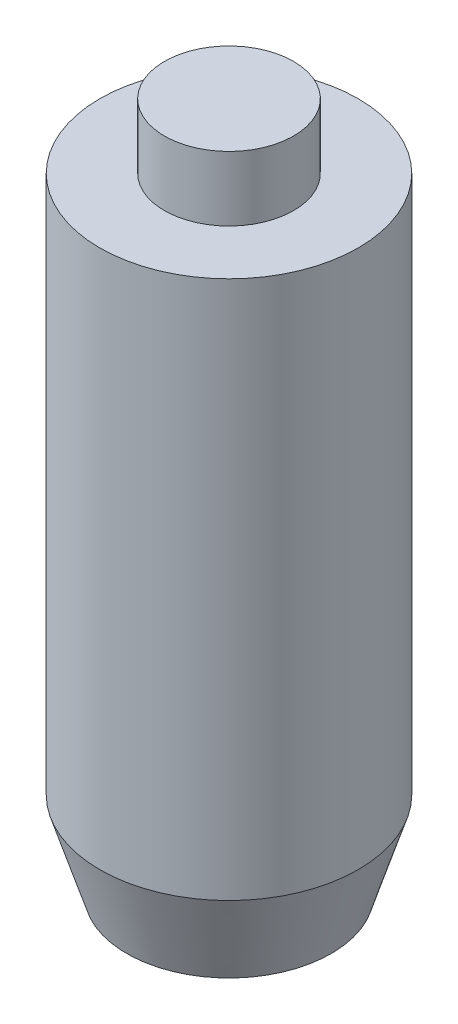
ISO-10303-21;
HEADER;
FILE_DESCRIPTION(('STEP AP214'),'2;1');
FILE_NAME('part.step','',(''),(''),'','','');
FILE_SCHEMA(('AUTOMOTIVE_DESIGN { 1 0 10303 214 1 1 1 1 }'));
ENDSEC;
DATA;
#1=APPLICATION_CONTEXT('core data for automotive mechanical design processes');
#2=APPLICATION_PROTOCOL_DEFINITION('international standard','automotive_design',2000,#1);
#3=PRODUCT_CONTEXT('',#1,'mechanical');
#4=PRODUCT('Part','Part','',(#3));
#5=PRODUCT_RELATED_PRODUCT_CATEGORY('part','',(#4));
#6=PRODUCT_DEFINITION_FORMATION('','',#4);
#7=PRODUCT_DEFINITION_CONTEXT('part definition',#1,'design');
#8=PRODUCT_DEFINITION('design','',#6,#7);
#9=PRODUCT_DEFINITION_SHAPE('','',#8);
#10=(LENGTH_UNIT() NAMED_UNIT(*) SI_UNIT(.MILLI.,.METRE.));
#11=(NAMED_UNIT(*) PLANE_ANGLE_UNIT() SI_UNIT($,.RADIAN.));
#12=(NAMED_UNIT(*) SI_UNIT($,.STERADIAN.) SOLID_ANGLE_UNIT());
#13=UNCERTAINTY_MEASURE_WITH_UNIT(LENGTH_MEASURE(1.E-05),#10,'distance_accuracy_value','');
#14=(GEOMETRIC_REPRESENTATION_CONTEXT(3) GLOBAL_UNCERTAINTY_ASSIGNED_CONTEXT((#13)) GLOBAL_UNIT_ASSIGNED_CONTEXT((#10,
#11,#12)) REPRESENTATION_CONTEXT('',''));
#15=CARTESIAN_POINT('',(0.,0.,0.));
#16=DIRECTION('',(0.,0.,1.));
#17=DIRECTION('',(1.,0.,0.));
#18=AXIS2_PLACEMENT_3D('',#15,#16,#17);
#19=CARTESIAN_POINT('',(29.75,112.5,0.));
#20=DIRECTION('',(0.,1.,0.));
#21=DIRECTION('',(0.,0.,1.));
#22=AXIS2_PLACEMENT_3D('',#19,#20,#21);
#23=PLANE('',#22);
#24=CARTESIAN_POINT('',(29.75,112.5,0.));
#25=DIRECTION('',(0.,-1.,0.));
#26=DIRECTION('',(0.,0.,-1.));
#27=AXIS2_PLACEMENT_3D('',#24,#25,#26);
#28=CIRCLE('',#27,3.);
#29=CARTESIAN_POINT('',(29.75,112.5,-3.));
#30=VERTEX_POINT('',#29);
#31=EDGE_CURVE('E41',#30,#30,#28,.T.);
#32=ORIENTED_EDGE('',*,*,#31,.F.);
#33=EDGE_LOOP('',(#32));
#34=FACE_BOUND('',#33,.T.);
#35=ADVANCED_FACE('F31',(#34),#23,.T.);
#36=CARTESIAN_POINT('',(29.75,33.4895404193071,0.));
#37=DIRECTION('',(0.,-1.,0.));
#38=DIRECTION('',(0.,0.,-1.));
#39=AXIS2_PLACEMENT_3D('',#36,#37,#38);
#40=CYLINDRICAL_SURFACE('',#39,3.);
#41=ORIENTED_EDGE('',*,*,#31,.T.);
#42=EDGE_LOOP('',(#41));
#43=FACE_BOUND('',#42,.T.);
#44=CARTESIAN_POINT('',(29.75,109.5,0.));
#45=DIRECTION('',(0.,-1.,0.));
#46=DIRECTION('',(0.,0.,-1.));
#47=AXIS2_PLACEMENT_3D('',#44,#45,#46);
#48=CIRCLE('',#47,3.);
#49=CARTESIAN_POINT('',(29.75,109.5,-3.));
#50=VERTEX_POINT('',#49);
#51=EDGE_CURVE('E45',#50,#50,#48,.T.);
#52=ORIENTED_EDGE('',*,*,#51,.F.);
#53=EDGE_LOOP('',(#52));
#54=FACE_BOUND('',#53,.T.);
#55=ADVANCED_FACE('F81',(#43,#54),#40,.T.);
#56=CARTESIAN_POINT('',(32.75,109.5,0.));
#57=DIRECTION('',(0.,1.,0.));
#58=DIRECTION('',(0.,0.,1.));
#59=AXIS2_PLACEMENT_3D('',#56,#57,#58);
#60=PLANE('',#59);
#61=ORIENTED_EDGE('',*,*,#51,.T.);
#62=EDGE_LOOP('',(#61));
#63=FACE_BOUND('',#62,.T.);
#64=CARTESIAN_POINT('',(29.75,109.5,0.));
#65=DIRECTION('',(0.,-1.,0.));
#66=DIRECTION('',(0.,0.,-1.));
#67=AXIS2_PLACEMENT_3D('',#64,#65,#66);
#68=CIRCLE('',#67,6.00000000000001);
#69=CARTESIAN_POINT('',(29.75,109.5,-6.00000000000001));
#70=VERTEX_POINT('',#69);
#71=EDGE_CURVE('E50',#70,#70,#68,.T.);
#72=ORIENTED_EDGE('',*,*,#71,.F.);
#73=EDGE_LOOP('',(#72));
#74=FACE_BOUND('',#73,.T.);
#75=ADVANCED_FACE('F86',(#63,#74),#60,.T.);
#76=CARTESIAN_POINT('',(29.75,33.4895404193071,0.));
#77=DIRECTION('',(0.,-1.,0.));
#78=DIRECTION('',(0.,0.,-1.));
#79=AXIS2_PLACEMENT_3D('',#76,#77,#78);
#80=CYLINDRICAL_SURFACE('',#79,6.00000000000001);
#81=CARTESIAN_POINT('',(29.75,102.85,-6.00000000000001));
#82=CARTESIAN_POINT('',(29.8368551540295,102.850000304322,-6.00000027636888));
#83=CARTESIAN_POINT('',(29.9237059578463,102.846618418426,-5.99810998912827));
#84=CARTESIAN_POINT('',(30.0967517749576,102.833136348748,-5.99059818772049));
#85=CARTESIAN_POINT('',(30.1829465485054,102.823033817904,-5.98497537003771));
#86=CARTESIAN_POINT('',(30.3539678085947,102.79624171794,-5.97014105022579));
#87=CARTESIAN_POINT('',(30.4387946890976,102.779554081955,-5.96093060129874));
#88=CARTESIAN_POINT('',(30.6065133126573,102.73980349301,-5.93915440656428));
#89=CARTESIAN_POINT('',(30.6894042450665,102.716737919512,-5.92658728165435));
#90=CARTESIAN_POINT('',(30.9336532074442,102.638557897051,-5.88439376853852));
#91=CARTESIAN_POINT('',(31.0914147092894,102.574327603266,-5.85019917962473));
#92=CARTESIAN_POINT('',(31.3935292768716,102.424014620956,-5.77262790541994));
#93=CARTESIAN_POINT('',(31.5378790688034,102.337926615996,-5.72924898665785));
#94=CARTESIAN_POINT('',(31.8205178397697,102.139564400775,-5.63353551950775));
#95=CARTESIAN_POINT('',(31.9576758857777,102.025879330651,-5.58078670377474));
#96=CARTESIAN_POINT('',(32.2120587356691,101.778657967711,-5.47333373388227));
#97=CARTESIAN_POINT('',(32.3292629196769,101.645101403937,-5.41862762688137));
#98=CARTESIAN_POINT('',(32.5525677875686,101.345666831759,-5.30685805578659));
#99=CARTESIAN_POINT('',(32.6562949058159,101.177878481893,-5.25012874775908));
#100=CARTESIAN_POINT('',(32.8336080224297,100.823964830311,-5.14799909803482));
#101=CARTESIAN_POINT('',(32.9072375745185,100.637866512332,-5.10258242347392));
#102=CARTESIAN_POINT('',(33.0086201803895,100.293086898827,-5.03827388818848));
#103=CARTESIAN_POINT('',(33.0427910003627,100.136961257846,-5.01579940121693));
#104=CARTESIAN_POINT('',(33.0885018346884,99.8200943558299,-4.985498277761));
#105=CARTESIAN_POINT('',(33.1000644796513,99.6593578739613,-4.97765699391097));
#106=CARTESIAN_POINT('',(33.099934887448,99.3377218199167,-4.97774397632757));
#107=CARTESIAN_POINT('',(33.0882161502392,99.1768222704877,-4.98569021274607));
#108=CARTESIAN_POINT('',(33.0421464413088,98.8596986440607,-5.01622419723049));
#109=CARTESIAN_POINT('',(33.0077806088655,98.7034777075228,-5.0388215590121));
#110=CARTESIAN_POINT('',(32.9180807329477,98.3996021576457,-5.09568908770972));
#111=CARTESIAN_POINT('',(32.8627560778565,98.2519437428727,-5.12995402750751));
#112=CARTESIAN_POINT('',(32.7330323895877,97.9675233971528,-5.20645555081259));
#113=CARTESIAN_POINT('',(32.6586259288189,97.8307657365567,-5.24869523679619));
#114=CARTESIAN_POINT('',(32.479629990647,97.5497549247423,-5.34423968929555));
#115=CARTESIAN_POINT('',(32.3721611936242,97.4075707657632,-5.39824783610552));
#116=CARTESIAN_POINT('',(32.136171877236,97.1419685903024,-5.50664097372976));
#117=CARTESIAN_POINT('',(32.0076345089257,97.0185657471861,-5.56102623251527));
#118=CARTESIAN_POINT('',(31.7169952521756,96.7811627794859,-5.67074625744229));
#119=CARTESIAN_POINT('',(31.5527964393194,96.6694573616843,-5.72559682611537));
#120=CARTESIAN_POINT('',(31.2918780975823,96.5242548218518,-5.79921064420883));
#121=CARTESIAN_POINT('',(31.2024317198732,96.479567131229,-5.82231206815501));
#122=CARTESIAN_POINT('',(31.0192092036394,96.3981236062433,-5.86497464495178));
#123=CARTESIAN_POINT('',(30.9254356986299,96.3613630227144,-5.88453791638603));
#124=CARTESIAN_POINT('',(30.7409744146134,96.2985489041987,-5.91828855790644));
#125=CARTESIAN_POINT('',(30.6505317267497,96.2719251180123,-5.93275680054454));
#126=CARTESIAN_POINT('',(30.4672429817222,96.2263208881226,-5.95769335902741));
#127=CARTESIAN_POINT('',(30.3743982245178,96.2073363985856,-5.96816379199401));
#128=CARTESIAN_POINT('',(30.1870936737385,96.1772849302904,-5.98479546407428));
#129=CARTESIAN_POINT('',(30.0926347215339,96.1662139483292,-5.99095888194058));
#130=CARTESIAN_POINT('',(29.9029649192467,96.1521409703368,-5.99880262492516));
#131=CARTESIAN_POINT('',(29.8077541457922,96.149138162352,-6.00048340116119));
#132=CARTESIAN_POINT('',(29.5441890569086,96.1521036201346,-5.99882157990127));
#133=CARTESIAN_POINT('',(29.3758588198304,96.1667403606259,-5.99062543549092));
#134=CARTESIAN_POINT('',(29.0445971642846,96.2208028552261,-5.96071694620634));
#135=CARTESIAN_POINT('',(28.8816659080745,96.2602293536403,-5.93900419550006));
#136=CARTESIAN_POINT('',(28.566025480184,96.361837597776,-5.88419460559967));
#137=CARTESIAN_POINT('',(28.4132713714545,96.4239102110766,-5.85115240860889));
#138=CARTESIAN_POINT('',(28.1201944285302,96.5686215319669,-5.77638709310673));
#139=CARTESIAN_POINT('',(27.9798748751021,96.6512656454187,-5.73466169326145));
#140=CARTESIAN_POINT('',(27.7000513265921,96.8444345902526,-5.64106881263141));
#141=CARTESIAN_POINT('',(27.5621298111738,96.9569579390029,-5.58859885623955));
#142=CARTESIAN_POINT('',(27.3060627620048,97.2019306131935,-5.48146709171847));
#143=CARTESIAN_POINT('',(27.1879394580852,97.3344020241844,-5.42680290406517));
#144=CARTESIAN_POINT('',(26.9625405359646,97.6316212684909,-5.31483492164684));
#145=CARTESIAN_POINT('',(26.8576219506571,97.7982862557179,-5.25783588780468));
#146=CARTESIAN_POINT('',(26.6776869545542,98.1500813156604,-5.154774733582));
#147=CARTESIAN_POINT('',(26.6026285996905,98.3351850272762,-5.10869730889801));
#148=CARTESIAN_POINT('',(26.498304045392,98.6789403576196,-5.04276262548888));
#149=CARTESIAN_POINT('',(26.4627399602819,98.8350138599545,-5.01943518993202));
#150=CARTESIAN_POINT('',(26.4142727102012,99.1520503330197,-4.98736443622106));
#151=CARTESIAN_POINT('',(26.4013463642675,99.3130081301724,-4.97860619972118));
#152=CARTESIAN_POINT('',(26.3988522186784,99.6354066793786,-4.97692798865142));
#153=CARTESIAN_POINT('',(26.4093164165009,99.7968477909284,-4.98402970995866));
#154=CARTESIAN_POINT('',(26.4530598234623,100.115265612845,-5.01306740779636));
#155=CARTESIAN_POINT('',(26.4863536153714,100.27223940285,-5.03501286588049));
#156=CARTESIAN_POINT('',(26.5738965673795,100.576982792717,-5.09067835832131));
#157=CARTESIAN_POINT('',(26.6280324101682,100.724797231368,-5.12433462791327));
#158=CARTESIAN_POINT('',(26.7553845682887,101.009688490857,-5.19978335620498));
#159=CARTESIAN_POINT('',(26.8286081858021,101.146761176193,-5.24157892710873));
#160=CARTESIAN_POINT('',(27.004894575762,101.428340657665,-5.33627524257005));
#161=CARTESIAN_POINT('',(27.11079678963,101.57083001576,-5.3898992290315));
#162=CARTESIAN_POINT('',(27.343581925839,101.83731085614,-5.49778674900258));
#163=CARTESIAN_POINT('',(27.4704818759373,101.961287169071,-5.55205076809344));
#164=CARTESIAN_POINT('',(27.758187223614,102.200696567972,-5.66204551591838));
#165=CARTESIAN_POINT('',(27.9211713378169,102.31377659422,-5.7173062588729));
#166=CARTESIAN_POINT('',(28.1804155087186,102.461220548991,-5.79176593089869));
#167=CARTESIAN_POINT('',(28.2693281704916,102.50668557946,-5.81518787866733));
#168=CARTESIAN_POINT('',(28.4515466179106,102.589744776144,-5.85856315041256));
#169=CARTESIAN_POINT('',(28.5448497337032,102.627343651933,-5.87851854863808));
#170=CARTESIAN_POINT('',(28.7281260653899,102.691708329043,-5.91302135380705));
#171=CARTESIAN_POINT('',(28.8178361911204,102.719069168371,-5.9278593417526));
#172=CARTESIAN_POINT('',(28.9997269760477,102.766253206775,-5.95361389647255));
#173=CARTESIAN_POINT('',(29.0919063105161,102.78608036427,-5.96453252242921));
#174=CARTESIAN_POINT('',(29.2779620183266,102.817918606935,-5.98213238555485));
#175=CARTESIAN_POINT('',(29.3718375767609,102.829933347886,-5.98881560462489));
#176=CARTESIAN_POINT('',(29.5604771921481,102.84597359265,-5.99774910252943));
#177=CARTESIAN_POINT('',(29.6552411850531,102.849999667985,-5.99999969848207));
#178=CARTESIAN_POINT('',(29.75,102.85,-6.00000000000001));
#179=B_SPLINE_CURVE_WITH_KNOTS('',3,(#81,#82,#83,#84,#85,#86,#87,#88,#89,#90,#91,#92,#93,#94,
#95,#96,#97,#98,#99,#100,#101,#102,#103,#104,#105,#106,#107,#108,#109,#110,#111,#112,#113,#114,
#115,#116,#117,#118,#119,#120,#121,#122,#123,#124,#125,#126,#127,#128,#129,#130,#131,#132,#133,
#134,#135,#136,#137,#138,#139,#140,#141,#142,#143,#144,#145,#146,#147,#148,#149,#150,#151,#152,
#153,#154,#155,#156,#157,#158,#159,#160,#161,#162,#163,#164,#165,#166,#167,#168,#169,#170,#171,
#172,#173,#174,#175,#176,#177,#178),.UNSPECIFIED.,.T.,.F.,(4,2,2,2,2,2,2,2,2,2,2,2,2,2,2,2,2,2,
2,2,2,2,2,2,2,2,2,2,2,2,2,2,2,2,2,2,2,2,2,2,2,2,2,2,2,2,2,2,4),(0.,0.260471705958155,
0.52103442461859,0.781520708827848,1.04211417983508,1.56080938242307,2.07963086794375,
2.63475725826134,3.19045386694897,3.80317389758447,4.41500410464307,4.89707807136326,
5.37866923818835,5.8608088904248,6.34326523171541,6.82550571453175,7.30793419507963,
7.86437671475594,8.42126642312554,9.03578789468688,9.34328329595148,9.65059396032605,
9.93634393493258,10.2219423742209,10.5073962354983,10.7928213685897,11.2976118803894,
11.8024175491032,12.3048219985583,12.8073586115272,13.3618223946317,13.916904629692,
14.5289478675757,15.1401283190041,15.6233193211286,16.1060152474688,16.589371889656,
17.0730375716365,17.5541098973533,18.035366531934,18.5894993720118,19.1440837990039,
19.75831695226,20.0656672543029,20.3728330115786,20.6573103271066,20.9416379624048,
21.2258324520213,21.5100066090946),.UNSPECIFIED.);
#180=CARTESIAN_POINT('',(29.75,102.85,-6.00000000000001));
#181=VERTEX_POINT('',#180);
#182=EDGE_CURVE('E10',#181,#181,#179,.T.);
#183=ORIENTED_EDGE('',*,*,#182,.F.);
#184=EDGE_LOOP('',(#183));
#185=FACE_BOUND('',#184,.T.);
#186=ORIENTED_EDGE('',*,*,#71,.T.);
#187=EDGE_LOOP('',(#186));
#188=FACE_BOUND('',#187,.T.);
#189=CARTESIAN_POINT('',(29.75,84.5,0.));
#190=DIRECTION('',(0.,-1.,0.));
#191=DIRECTION('',(0.,0.,-1.));
#192=AXIS2_PLACEMENT_3D('',#189,#190,#191);
#193=CIRCLE('',#192,6.00000000000001);
#194=CARTESIAN_POINT('',(29.75,84.5,-6.00000000000001));
#195=VERTEX_POINT('',#194);
#196=EDGE_CURVE('E114',#195,#195,#193,.T.);
#197=ORIENTED_EDGE('',*,*,#196,.F.);
#198=EDGE_LOOP('',(#197));
#199=FACE_BOUND('',#198,.T.);
#200=ADVANCED_FACE('F90',(#185,#188,#199),#80,.T.);
#201=CARTESIAN_POINT('',(29.75,80.5,0.));
#202=DIRECTION('',(0.,1.,0.));
#203=DIRECTION('',(0.,0.,1.));
#204=AXIS2_PLACEMENT_3D('',#201,#202,#203);
#205=CONICAL_SURFACE('',#204,4.75,0.302884868374973);
#206=ORIENTED_EDGE('',*,*,#196,.T.);
#207=EDGE_LOOP('',(#206));
#208=FACE_BOUND('',#207,.T.);
#209=CARTESIAN_POINT('',(29.75,80.5,0.));
#210=DIRECTION('',(0.,-1.,0.));
#211=DIRECTION('',(0.,0.,-1.));
#212=AXIS2_PLACEMENT_3D('',#209,#210,#211);
#213=CIRCLE('',#212,4.75);
#214=CARTESIAN_POINT('',(29.75,80.5,-4.75));
#215=VERTEX_POINT('',#214);
#216=EDGE_CURVE('E108',#215,#215,#213,.T.);
#217=ORIENTED_EDGE('',*,*,#216,.F.);
#218=EDGE_LOOP('',(#217));
#219=FACE_BOUND('',#218,.T.);
#220=ADVANCED_FACE('F97',(#208,#219),#205,.T.);
#221=CARTESIAN_POINT('',(34.5,80.5,0.));
#222=DIRECTION('',(0.,-1.,0.));
#223=DIRECTION('',(0.,0.,-1.));
#224=AXIS2_PLACEMENT_3D('',#221,#222,#223);
#225=PLANE('',#224);
#226=ORIENTED_EDGE('',*,*,#216,.T.);
#227=EDGE_LOOP('',(#226));
#228=FACE_BOUND('',#227,.T.);
#229=CARTESIAN_POINT('',(29.75,80.5,0.));
#230=DIRECTION('',(0.,-1.,0.));
#231=DIRECTION('',(0.,0.,-1.));
#232=AXIS2_PLACEMENT_3D('',#229,#230,#231);
#233=CIRCLE('',#232,2.25);
#234=CARTESIAN_POINT('',(29.75,80.5,-2.25));
#235=VERTEX_POINT('',#234);
#236=EDGE_CURVE('E111',#235,#235,#233,.T.);
#237=ORIENTED_EDGE('',*,*,#236,.F.);
#238=EDGE_LOOP('',(#237));
#239=FACE_BOUND('',#238,.T.);
#240=ADVANCED_FACE('F77',(#228,#239),#225,.T.);
#241=CARTESIAN_POINT('',(29.75,33.4895404193071,0.));
#242=DIRECTION('',(0.,-1.,0.));
#243=DIRECTION('',(0.,0.,-1.));
#244=AXIS2_PLACEMENT_3D('',#241,#242,#243);
#245=CYLINDRICAL_SURFACE('',#244,2.25);
#246=CARTESIAN_POINT('',(29.75,101.2,-2.25));
#247=CARTESIAN_POINT('',(29.6671505458232,101.199993737984,-2.24999397873747));
#248=CARTESIAN_POINT('',(29.5841819620442,101.193894971028,-2.24537639018974));
#249=CARTESIAN_POINT('',(29.4208715135823,101.169886839272,-2.22732168603813));
#250=CARTESIAN_POINT('',(29.3405359659719,101.151950982857,-2.21386478822356));
#251=CARTESIAN_POINT('',(29.1852820029082,101.105497340953,-2.17942208711645));
#252=CARTESIAN_POINT('',(29.1103341792896,101.077043202063,-2.15848159222476));
#253=CARTESIAN_POINT('',(28.9667823851186,101.01090153919,-2.11064041652594));
#254=CARTESIAN_POINT('',(28.8981770409221,100.973216021008,-2.0837410305923));
#255=CARTESIAN_POINT('',(28.7619824228829,100.885986505721,-2.02296451421029));
#256=CARTESIAN_POINT('',(28.6950801859493,100.83566590281,-1.98867122471777));
#257=CARTESIAN_POINT('',(28.5701084384363,100.726680316013,-1.91717287667736));
#258=CARTESIAN_POINT('',(28.5120525764834,100.668002703009,-1.87996345025049));
#259=CARTESIAN_POINT('',(28.3940839086691,100.530216100721,-1.79727033349693));
#260=CARTESIAN_POINT('',(28.3362563957584,100.449388999595,-1.75166249671311));
#261=CARTESIAN_POINT('',(28.2347711050041,100.277203060994,-1.66463962039784));
#262=CARTESIAN_POINT('',(28.1910947280195,100.185858263063,-1.62321912704701));
#263=CARTESIAN_POINT('',(28.1321788266099,100.026450983914,-1.56405221273397));
#264=CARTESIAN_POINT('',(28.1123306618746,99.9613065323178,-1.54307806859753));
#265=CARTESIAN_POINT('',(28.0803947272107,99.8273218484432,-1.50846819980739));
#266=CARTESIAN_POINT('',(28.0682890097563,99.7584905672068,-1.49481551547025));
#267=CARTESIAN_POINT('',(28.0526099593748,99.6179086940979,-1.47699815695633));
#268=CARTESIAN_POINT('',(28.0491180920724,99.5461367071323,-1.47292408950747));
#269=CARTESIAN_POINT('',(28.0512638660068,99.4029008555726,-1.47539698661642));
#270=CARTESIAN_POINT('',(28.0569041427352,99.3314370858966,-1.48194701723747));
#271=CARTESIAN_POINT('',(28.0756437395046,99.1991752619719,-1.50306099576302));
#272=CARTESIAN_POINT('',(28.087837072603,99.1380789804141,-1.51664541432918));
#273=CARTESIAN_POINT('',(28.1183121466377,99.0189814951112,-1.5493857394743));
#274=CARTESIAN_POINT('',(28.1365999334447,98.9609834314429,-1.56854717621342));
#275=CARTESIAN_POINT('',(28.1920042422165,98.8127569156963,-1.62403598710185));
#276=CARTESIAN_POINT('',(28.2337046404938,98.725432190513,-1.66354017113546));
#277=CARTESIAN_POINT('',(28.3300971274357,98.5602924368057,-1.74655367758269));
#278=CARTESIAN_POINT('',(28.3848212518475,98.4825015860548,-1.79007271147123));
#279=CARTESIAN_POINT('',(28.5082093969918,98.3349043364819,-1.87785794333564));
#280=CARTESIAN_POINT('',(28.5772118826979,98.2653724301132,-1.92211229852996));
#281=CARTESIAN_POINT('',(28.7276511542865,98.138211998648,-2.00616643208755));
#282=CARTESIAN_POINT('',(28.8090640877237,98.0805611281439,-2.04597450702053));
#283=CARTESIAN_POINT('',(28.9663316105126,97.9892286363868,-2.1104757396617));
#284=CARTESIAN_POINT('',(29.0401500542936,97.9530638613107,-2.13660219069135));
#285=CARTESIAN_POINT('',(29.1941539019519,97.8913041035367,-2.18173238919923));
#286=CARTESIAN_POINT('',(29.2743353827685,97.8657026675735,-2.20074048470502));
#287=CARTESIAN_POINT('',(29.4397020095911,97.8263881777529,-2.23009047093789));
#288=CARTESIAN_POINT('',(29.5249158018483,97.8127519727659,-2.24037632753943));
#289=CARTESIAN_POINT('',(29.697034973609,97.7986364177467,-2.25102530693164));
#290=CARTESIAN_POINT('',(29.7839395251767,97.7981507826899,-2.25139316980798));
#291=CARTESIAN_POINT('',(29.9471788051935,97.8097019038674,-2.24267653074886));
#292=CARTESIAN_POINT('',(30.0236656878411,97.8204298840083,-2.23457992730991));
#293=CARTESIAN_POINT('',(30.1734040168886,97.8517940075767,-2.21110267808525));
#294=CARTESIAN_POINT('',(30.2466548090944,97.8724321444807,-2.19572056679244));
#295=CARTESIAN_POINT('',(30.3904966939951,97.9233687372855,-2.15823070947003));
#296=CARTESIAN_POINT('',(30.460939868445,97.9539410462043,-2.13593323478861));
#297=CARTESIAN_POINT('',(30.5956612517408,98.0233130241773,-2.08626914727309));
#298=CARTESIAN_POINT('',(30.6599385681338,98.0621138816385,-2.05890180229584));
#299=CARTESIAN_POINT('',(30.7918767277862,98.1539016927694,-1.99579188283585));
#300=CARTESIAN_POINT('',(30.8583361681219,98.2081737405004,-1.95941283708105));
#301=CARTESIAN_POINT('',(30.9818250874822,98.3253215771646,-1.88423716670643));
#302=CARTESIAN_POINT('',(31.0388341803369,98.3882154448331,-1.84543555796369));
#303=CARTESIAN_POINT('',(31.1531890549757,98.5349375889283,-1.76055453814918));
#304=CARTESIAN_POINT('',(31.2084251837257,98.6204552923362,-1.71453409249649));
#305=CARTESIAN_POINT('',(31.3036606278969,98.8024146251415,-1.62871868802409));
#306=CARTESIAN_POINT('',(31.3436998499486,98.8988267687945,-1.58890758807717));
#307=CARTESIAN_POINT('',(31.3940483812789,99.0625770419394,-1.53635538702391));
#308=CARTESIAN_POINT('',(31.4098671845648,99.1267512002189,-1.51909870648425));
#309=CARTESIAN_POINT('',(31.434002716924,99.2579975022364,-1.49230197356489));
#310=CARTESIAN_POINT('',(31.4423369226458,99.3250625096742,-1.48274395011818));
#311=CARTESIAN_POINT('',(31.4509157840011,99.4608437212132,-1.47290084838627));
#312=CARTESIAN_POINT('',(31.4511102753376,99.5295675535174,-1.47267327295258));
#313=CARTESIAN_POINT('',(31.443263829678,99.6659432195737,-1.48168358075368));
#314=CARTESIAN_POINT('',(31.4352134816389,99.7335937385914,-1.49093228065497));
#315=CARTESIAN_POINT('',(31.4092936286168,99.8783160434275,-1.51976193925926));
#316=CARTESIAN_POINT('',(31.3898652998469,99.9547742138149,-1.54095580582177));
#317=CARTESIAN_POINT('',(31.3416711641474,100.102189468604,-1.59068466729391));
#318=CARTESIAN_POINT('',(31.3128814268739,100.17313187107,-1.61923843694898));
#319=CARTESIAN_POINT('',(31.2347322079535,100.334464395624,-1.69170116076344));
#320=CARTESIAN_POINT('',(31.1817046130043,100.422279975101,-1.73737230621705));
#321=CARTESIAN_POINT('',(31.0612809378866,100.586707398944,-1.82998390277984));
#322=CARTESIAN_POINT('',(30.9938699560497,100.663307483828,-1.8769256258701));
#323=CARTESIAN_POINT('',(30.844337212645,100.805049967482,-1.96791357382008));
#324=CARTESIAN_POINT('',(30.7620543186165,100.870049594341,-2.01192002823544));
#325=CARTESIAN_POINT('',(30.5841874205313,100.985014632989,-2.09190644340709));
#326=CARTESIAN_POINT('',(30.488635717706,101.035015649961,-2.12790535983962));
#327=CARTESIAN_POINT('',(30.3158602193971,101.104932625199,-2.17897316915557));
#328=CARTESIAN_POINT('',(30.24134740892,101.129367874145,-2.19708424405038));
#329=CARTESIAN_POINT('',(30.0883793245204,101.167836051893,-2.22576028805344));
#330=CARTESIAN_POINT('',(30.0099349075074,101.181896105379,-2.23634493144164));
#331=CARTESIAN_POINT('',(29.9007153116142,101.193575438008,-2.24514925156896));
#332=CARTESIAN_POINT('',(29.870658936276,101.195980842568,-2.24696458250429));
#333=CARTESIAN_POINT('',(29.8104070058018,101.199194429022,-2.249391177982));
#334=CARTESIAN_POINT('',(29.780211423404,101.200002283472,-2.25000219568027));
#335=CARTESIAN_POINT('',(29.75,101.2,-2.25));
#336=B_SPLINE_CURVE_WITH_KNOTS('',3,(#246,#247,#248,#249,#250,#251,#252,#253,#254,#255,#256,
#257,#258,#259,#260,#261,#262,#263,#264,#265,#266,#267,#268,#269,#270,#271,#272,#273,#274,#275,
#276,#277,#278,#279,#280,#281,#282,#283,#284,#285,#286,#287,#288,#289,#290,#291,#292,#293,#294,
#295,#296,#297,#298,#299,#300,#301,#302,#303,#304,#305,#306,#307,#308,#309,#310,#311,#312,#313,
#314,#315,#316,#317,#318,#319,#320,#321,#322,#323,#324,#325,#326,#327,#328,#329,#330,#331,#332,
#333,#334,#335),.UNSPECIFIED.,.T.,.F.,(4,2,2,2,2,2,2,2,2,2,2,2,2,2,2,2,2,2,2,2,2,2,2,2,2,2,2,2,
2,2,2,2,2,2,2,2,2,2,2,2,2,2,2,2,4),(0.,0.248417431616698,0.497392719749785,0.744885471433691,
0.992324495337502,1.26276052183969,1.53360965543993,1.86030481559939,2.18656883488803,
2.39963341243046,2.61220228419254,2.82677395132582,3.04140755382131,3.23200656161251,
3.4227952146774,3.73465980341038,4.0472995928972,4.36843710777816,4.68896501338578,
4.94669351382216,5.20426433099574,5.46347758336275,5.72256694829347,5.95446696711297,
6.18641365331143,6.42539088974673,6.66440266397513,6.9429816366619,7.22215394907489,
7.55586086401073,7.88868530965506,8.09288178655575,8.29660021244256,8.50157395220113,
8.70678191956022,8.95048907366782,9.19482417365175,9.52999179957438,9.86550837120354,
10.2049056629203,10.5434907648628,10.7839758883525,11.0238300434309,11.1143980076139,
11.2049845332836),.UNSPECIFIED.);
#337=CARTESIAN_POINT('',(29.75,101.2,-2.25));
#338=VERTEX_POINT('',#337);
#339=EDGE_CURVE('E53',#338,#338,#336,.T.);
#340=ORIENTED_EDGE('',*,*,#339,.F.);
#341=EDGE_LOOP('',(#340));
#342=FACE_BOUND('',#341,.T.);
#343=ORIENTED_EDGE('',*,*,#236,.T.);
#344=EDGE_LOOP('',(#343));
#345=FACE_BOUND('',#344,.T.);
#346=CARTESIAN_POINT('',(29.75,105.5,0.));
#347=DIRECTION('',(0.,-1.,0.));
#348=DIRECTION('',(0.,0.,-1.));
#349=AXIS2_PLACEMENT_3D('',#346,#347,#348);
#350=CIRCLE('',#349,2.25);
#351=CARTESIAN_POINT('',(29.75,105.5,-2.25));
#352=VERTEX_POINT('',#351);
#353=EDGE_CURVE('E59',#352,#352,#350,.T.);
#354=ORIENTED_EDGE('',*,*,#353,.F.);
#355=EDGE_LOOP('',(#354));
#356=FACE_BOUND('',#355,.T.);
#357=ADVANCED_FACE('F61',(#342,#345,#356),#245,.F.);
#358=CARTESIAN_POINT('',(29.75,105.5,0.));
#359=DIRECTION('',(0.,-1.,0.));
#360=DIRECTION('',(0.,0.,-1.));
#361=AXIS2_PLACEMENT_3D('',#358,#359,#360);
#362=PLANE('',#361);
#363=ORIENTED_EDGE('',*,*,#353,.T.);
#364=EDGE_LOOP('',(#363));
#365=FACE_BOUND('',#364,.T.);
#366=ADVANCED_FACE('F70',(#365),#362,.T.);
#367=CARTESIAN_POINT('',(29.75,99.5,-6.00000000000001));
#368=DIRECTION('',(0.,0.,-1.));
#369=DIRECTION('',(-1.,0.,0.));
#370=AXIS2_PLACEMENT_3D('',#367,#368,#369);
#371=CYLINDRICAL_SURFACE('',#370,1.7);
#372=ORIENTED_EDGE('',*,*,#339,.T.);
#373=EDGE_LOOP('',(#372));
#374=FACE_BOUND('',#373,.T.);
#375=CARTESIAN_POINT('',(29.75,99.5,-4.35000000000001));
#376=DIRECTION('',(0.,0.,-1.));
#377=DIRECTION('',(-1.,0.,0.));
#378=AXIS2_PLACEMENT_3D('',#375,#376,#377);
#379=CIRCLE('',#378,1.7);
#380=CARTESIAN_POINT('',(28.05,99.5,-4.35000000000001));
#381=VERTEX_POINT('',#380);
#382=EDGE_CURVE('E60',#381,#381,#379,.T.);
#383=ORIENTED_EDGE('',*,*,#382,.T.);
#384=EDGE_LOOP('',(#383));
#385=FACE_BOUND('',#384,.T.);
#386=ADVANCED_FACE('F65',(#374,#385),#371,.F.);
#387=CARTESIAN_POINT('',(31.45,99.5,-4.35000000000001));
#388=DIRECTION('',(0.,0.,1.));
#389=DIRECTION('',(1.,0.,0.));
#390=AXIS2_PLACEMENT_3D('',#387,#388,#389);
#391=PLANE('',#390);
#392=ORIENTED_EDGE('',*,*,#382,.F.);
#393=EDGE_LOOP('',(#392));
#394=FACE_BOUND('',#393,.T.);
#395=CARTESIAN_POINT('',(29.75,99.5,-4.35000000000001));
#396=DIRECTION('',(0.,0.,-1.));
#397=DIRECTION('',(-1.,0.,0.));
#398=AXIS2_PLACEMENT_3D('',#395,#396,#397);
#399=CIRCLE('',#398,3.35);
#400=CARTESIAN_POINT('',(26.4,99.5,-4.35000000000001));
#401=VERTEX_POINT('',#400);
#402=EDGE_CURVE('E129',#401,#401,#399,.T.);
#403=ORIENTED_EDGE('',*,*,#402,.T.);
#404=EDGE_LOOP('',(#403));
#405=FACE_BOUND('',#404,.T.);
#406=ADVANCED_FACE('F69',(#394,#405),#391,.F.);
#407=CARTESIAN_POINT('',(29.75,99.5,-6.00000000000001));
#408=DIRECTION('',(0.,0.,-1.));
#409=DIRECTION('',(-1.,0.,0.));
#410=AXIS2_PLACEMENT_3D('',#407,#408,#409);
#411=CYLINDRICAL_SURFACE('',#410,3.35);
#412=ORIENTED_EDGE('',*,*,#182,.T.);
#413=EDGE_LOOP('',(#412));
#414=FACE_BOUND('',#413,.T.);
#415=ORIENTED_EDGE('',*,*,#402,.F.);
#416=EDGE_LOOP('',(#415));
#417=FACE_BOUND('',#416,.T.);
#418=ADVANCED_FACE('F134',(#414,#417),#411,.F.);
#419=CLOSED_SHELL('',(#35,#55,#75,#200,#220,#240,#357,#366,#386,#406,#418));
#420=MANIFOLD_SOLID_BREP('B2',#419);
#421=ADVANCED_BREP_SHAPE_REPRESENTATION('',(#18,#420),#14);
#422=SHAPE_DEFINITION_REPRESENTATION(#9,#421);
ENDSEC;
END-ISO-10303-21;
